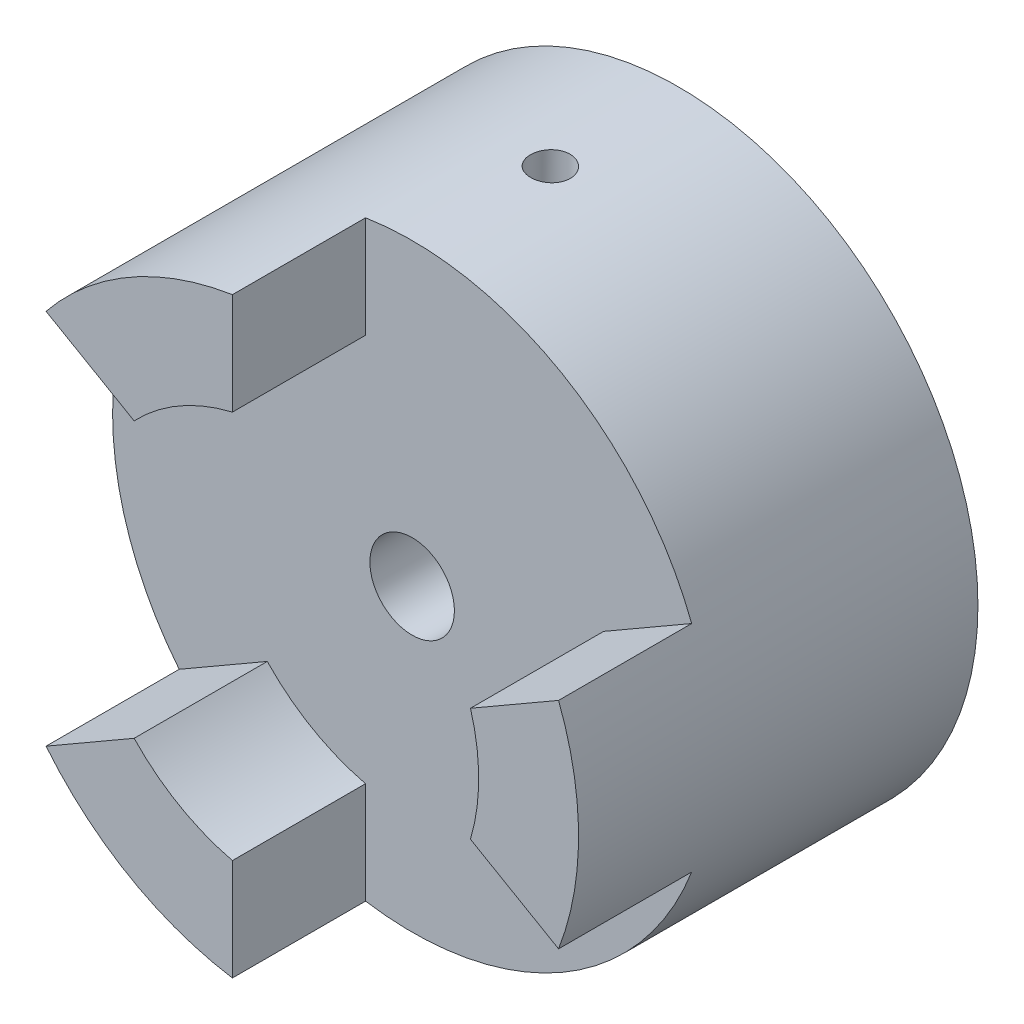
ISO-10303-21;
HEADER;
FILE_DESCRIPTION(('STEP AP214'),'2;1');
FILE_NAME('part.step','',(''),(''),'','','');
FILE_SCHEMA(('AUTOMOTIVE_DESIGN { 1 0 10303 214 1 1 1 1 }'));
ENDSEC;
DATA;
#1=APPLICATION_CONTEXT('core data for automotive mechanical design processes');
#2=APPLICATION_PROTOCOL_DEFINITION('international standard','automotive_design',2000,#1);
#3=PRODUCT_CONTEXT('',#1,'mechanical');
#4=PRODUCT('Part','Part','',(#3));
#5=PRODUCT_RELATED_PRODUCT_CATEGORY('part','',(#4));
#6=PRODUCT_DEFINITION_FORMATION('','',#4);
#7=PRODUCT_DEFINITION_CONTEXT('part definition',#1,'design');
#8=PRODUCT_DEFINITION('design','',#6,#7);
#9=PRODUCT_DEFINITION_SHAPE('','',#8);
#10=(LENGTH_UNIT() NAMED_UNIT(*) SI_UNIT(.MILLI.,.METRE.));
#11=(NAMED_UNIT(*) PLANE_ANGLE_UNIT() SI_UNIT($,.RADIAN.));
#12=(NAMED_UNIT(*) SI_UNIT($,.STERADIAN.) SOLID_ANGLE_UNIT());
#13=UNCERTAINTY_MEASURE_WITH_UNIT(LENGTH_MEASURE(1.E-05),#10,'distance_accuracy_value','');
#14=(GEOMETRIC_REPRESENTATION_CONTEXT(3) GLOBAL_UNCERTAINTY_ASSIGNED_CONTEXT((#13)) GLOBAL_UNIT_ASSIGNED_CONTEXT((#10,
#11,#12)) REPRESENTATION_CONTEXT('',''));
#15=CARTESIAN_POINT('',(0.,0.,0.));
#16=DIRECTION('',(0.,0.,1.));
#17=DIRECTION('',(1.,0.,0.));
#18=AXIS2_PLACEMENT_3D('',#15,#16,#17);
#19=CARTESIAN_POINT('',(0.,0.,20.));
#20=DIRECTION('',(0.,0.,1.));
#21=DIRECTION('',(1.,0.,0.));
#22=AXIS2_PLACEMENT_3D('',#19,#20,#21);
#23=PLANE('',#22);
#24=CARTESIAN_POINT('',(0.,0.,20.));
#25=DIRECTION('',(0.,0.,1.));
#26=DIRECTION('',(1.,0.,0.));
#27=AXIS2_PLACEMENT_3D('',#24,#25,#26);
#28=CIRCLE('',#27,3.175);
#29=CARTESIAN_POINT('',(3.175,0.,20.));
#30=VERTEX_POINT('',#29);
#31=EDGE_CURVE('E245',#30,#30,#28,.T.);
#32=ORIENTED_EDGE('',*,*,#31,.F.);
#33=EDGE_LOOP('',(#32));
#34=FACE_BOUND('',#33,.T.);
#35=CARTESIAN_POINT('',(0.,0.,20.));
#36=DIRECTION('',(0.,0.,-1.));
#37=DIRECTION('',(1.,0.,0.));
#38=AXIS2_PLACEMENT_3D('',#35,#36,#37);
#39=CIRCLE('',#38,15.);
#40=CARTESIAN_POINT('',(-3.5,-14.5859521458148,20.));
#41=VERTEX_POINT('',#40);
#42=CARTESIAN_POINT('',(-10.8818050966599,-10.3240649861528,20.));
#43=VERTEX_POINT('',#42);
#44=EDGE_CURVE('E54',#41,#43,#39,.T.);
#45=ORIENTED_EDGE('',*,*,#44,.F.);
#46=DIRECTION('',(0.,1.,0.));
#47=VECTOR('',#46,1.);
#48=CARTESIAN_POINT('',(-3.5,-14.5859521458148,20.));
#49=LINE('',#48,#47);
#50=CARTESIAN_POINT('',(-3.5,-22.2261107708929,20.));
#51=VERTEX_POINT('',#50);
#52=EDGE_CURVE('E403',#51,#41,#49,.T.);
#53=ORIENTED_EDGE('',*,*,#52,.F.);
#54=CARTESIAN_POINT('',(0.,0.,20.));
#55=DIRECTION('',(0.,0.,1.));
#56=DIRECTION('',(1.,0.,0.));
#57=AXIS2_PLACEMENT_3D('',#54,#55,#56);
#58=CIRCLE('',#57,22.5);
#59=CARTESIAN_POINT('',(20.9983765549201,-8.081966472201,20.));
#60=VERTEX_POINT('',#59);
#61=EDGE_CURVE('E40',#51,#60,#58,.T.);
#62=ORIENTED_EDGE('',*,*,#61,.T.);
#63=DIRECTION('',(0.866025403784436,-0.500000000000004,0.));
#64=VECTOR('',#63,1.);
#65=CARTESIAN_POINT('',(20.9983765549201,-8.081966472201,20.));
#66=LINE('',#65,#64);
#67=CARTESIAN_POINT('',(14.3818050966598,-4.26188715966194,20.));
#68=VERTEX_POINT('',#67);
#69=EDGE_CURVE('E162',#68,#60,#66,.T.);
#70=ORIENTED_EDGE('',*,*,#69,.F.);
#71=CARTESIAN_POINT('',(0.,0.,20.));
#72=DIRECTION('',(0.,0.,-1.));
#73=DIRECTION('',(1.,0.,0.));
#74=AXIS2_PLACEMENT_3D('',#71,#72,#73);
#75=CIRCLE('',#74,15.);
#76=CARTESIAN_POINT('',(14.3818050966598,4.26188715966176,20.));
#77=VERTEX_POINT('',#76);
#78=EDGE_CURVE('E152',#77,#68,#75,.T.);
#79=ORIENTED_EDGE('',*,*,#78,.F.);
#80=DIRECTION('',(-0.866025403784443,-0.499999999999992,0.));
#81=VECTOR('',#80,1.);
#82=CARTESIAN_POINT('',(14.3818050966598,4.26188715966176,20.));
#83=LINE('',#82,#81);
#84=CARTESIAN_POINT('',(20.9983765549202,8.08196647220072,20.));
#85=VERTEX_POINT('',#84);
#86=EDGE_CURVE('E150',#85,#77,#83,.T.);
#87=ORIENTED_EDGE('',*,*,#86,.F.);
#88=CARTESIAN_POINT('',(-3.50000000000001,22.2261107708929,20.));
#89=VERTEX_POINT('',#88);
#90=EDGE_CURVE('E217',#85,#89,#58,.T.);
#91=ORIENTED_EDGE('',*,*,#90,.T.);
#92=DIRECTION('',(0.,1.,0.));
#93=VECTOR('',#92,1.);
#94=CARTESIAN_POINT('',(-3.5,22.2261107708929,20.));
#95=LINE('',#94,#93);
#96=CARTESIAN_POINT('',(-3.5,14.5859521458148,20.));
#97=VERTEX_POINT('',#96);
#98=EDGE_CURVE('E195',#97,#89,#95,.T.);
#99=ORIENTED_EDGE('',*,*,#98,.F.);
#100=CARTESIAN_POINT('',(0.,0.,20.));
#101=DIRECTION('',(0.,0.,-1.));
#102=DIRECTION('',(1.,0.,0.));
#103=AXIS2_PLACEMENT_3D('',#100,#101,#102);
#104=CIRCLE('',#103,15.);
#105=CARTESIAN_POINT('',(-10.8818050966597,10.324064986153,20.));
#106=VERTEX_POINT('',#105);
#107=EDGE_CURVE('E181',#106,#97,#104,.T.);
#108=ORIENTED_EDGE('',*,*,#107,.F.);
#109=DIRECTION('',(0.866025403784436,-0.500000000000004,0.));
#110=VECTOR('',#109,1.);
#111=CARTESIAN_POINT('',(-17.4983765549201,14.1441442986921,20.));
#112=LINE('',#111,#110);
#113=CARTESIAN_POINT('',(-17.4983765549201,14.144144298692,20.));
#114=VERTEX_POINT('',#113);
#115=EDGE_CURVE('E186',#114,#106,#112,.T.);
#116=ORIENTED_EDGE('',*,*,#115,.F.);
#117=CARTESIAN_POINT('',(-17.4983765549203,-14.1441442986918,20.));
#118=VERTEX_POINT('',#117);
#119=EDGE_CURVE('E46',#114,#118,#58,.T.);
#120=ORIENTED_EDGE('',*,*,#119,.T.);
#121=DIRECTION('',(-0.866025403784443,-0.499999999999992,0.));
#122=VECTOR('',#121,1.);
#123=CARTESIAN_POINT('',(-17.4983765549203,-14.1441442986918,20.));
#124=LINE('',#123,#122);
#125=EDGE_CURVE('E59',#43,#118,#124,.T.);
#126=ORIENTED_EDGE('',*,*,#125,.F.);
#127=EDGE_LOOP('',(#45,#53,#62,#70,#79,#87,#91,#99,#108,#116,#120,#126));
#128=FACE_BOUND('',#127,.T.);
#129=ADVANCED_FACE('F35',(#34,#128),#23,.T.);
#130=CARTESIAN_POINT('',(0.,0.,20.));
#131=DIRECTION('',(0.,0.,-1.));
#132=DIRECTION('',(-1.,0.,0.));
#133=AXIS2_PLACEMENT_3D('',#130,#131,#132);
#134=CYLINDRICAL_SURFACE('',#133,22.5);
#135=CARTESIAN_POINT('',(-1.16795072214175,22.4696660213419,9.9509839765561));
#136=CARTESIAN_POINT('',(-1.16794701412822,22.4696666351266,9.86682882468708));
#137=CARTESIAN_POINT('',(-1.16083853462614,22.4700392018296,9.78261503637612));
#138=CARTESIAN_POINT('',(-1.13258449434566,22.471480697484,9.61651364954389));
#139=CARTESIAN_POINT('',(-1.11142267175415,22.4725504331371,9.5346288606282));
#140=CARTESIAN_POINT('',(-1.05567496758904,22.4752380311045,9.37561546316127));
#141=CARTESIAN_POINT('',(-1.02109626483874,22.4768556002368,9.29848433665232));
#142=CARTESIAN_POINT('',(-0.939510841472762,22.4804132200468,9.15113626091315));
#143=CARTESIAN_POINT('',(-0.892506933100566,22.4823531977157,9.08091775205354));
#144=CARTESIAN_POINT('',(-0.787321799091392,22.4862822653723,8.9492495333017));
#145=CARTESIAN_POINT('',(-0.729123980123893,22.488271424401,8.88781308018272));
#146=CARTESIAN_POINT('',(-0.603241089186681,22.4919998434333,8.77556647860183));
#147=CARTESIAN_POINT('',(-0.535555618423458,22.4937390929262,8.72475677703693));
#148=CARTESIAN_POINT('',(-0.392546510837813,22.4966890716028,8.63516458913433));
#149=CARTESIAN_POINT('',(-0.317215933429358,22.4978993151447,8.59639316367709));
#150=CARTESIAN_POINT('',(-0.161106583630494,22.4995584749486,8.53204891038463));
#151=CARTESIAN_POINT('',(-0.0803278761180135,22.500007400275,8.50647592540988));
#152=CARTESIAN_POINT('',(0.0842541461032171,22.4999924287302,8.46929151286395));
#153=CARTESIAN_POINT('',(0.168052740501643,22.499529900542,8.4576591934942));
#154=CARTESIAN_POINT('',(0.336402293717323,22.4976425119387,8.44862178180597));
#155=CARTESIAN_POINT('',(0.420953243062837,22.4962176636219,8.45121651062898));
#156=CARTESIAN_POINT('',(0.588266129708601,22.4924639826339,8.47054233443924));
#157=CARTESIAN_POINT('',(0.67103069653389,22.4901365901524,8.48725095768299));
#158=CARTESIAN_POINT('',(0.832565993292586,22.4847363612551,8.53429538928928));
#159=CARTESIAN_POINT('',(0.911336697020258,22.4816635199487,8.56463128705432));
#160=CARTESIAN_POINT('',(1.06272261164742,22.4750166272793,8.63809451797387));
#161=CARTESIAN_POINT('',(1.13533287297505,22.4714421789089,8.6812320136648));
#162=CARTESIAN_POINT('',(1.2722859030292,22.4641046836031,8.77906653524814));
#163=CARTESIAN_POINT('',(1.33662856545644,22.4603416342438,8.83376370974329));
#164=CARTESIAN_POINT('',(1.45535453244866,22.4529618562286,8.95329180612418));
#165=CARTESIAN_POINT('',(1.50971821721403,22.449345426488,9.01814223651269));
#166=CARTESIAN_POINT('',(1.60679530484671,22.4426064521477,9.15606769541081));
#167=CARTESIAN_POINT('',(1.64950870236193,22.439483907775,9.22914272769877));
#168=CARTESIAN_POINT('',(1.7220745704774,22.4340319588832,9.38145576222379));
#169=CARTESIAN_POINT('',(1.75192618133141,22.4317026073872,9.46069417603434));
#170=CARTESIAN_POINT('',(1.79790975507206,22.4280640531212,9.62307881670943));
#171=CARTESIAN_POINT('',(1.81404190173043,22.4267548366865,9.7062249912139));
#172=CARTESIAN_POINT('',(1.83210546711131,22.4252864697945,9.87389368251136));
#173=CARTESIAN_POINT('',(1.83406414738777,22.4251251115319,9.95841324354472));
#174=CARTESIAN_POINT('',(1.82379660597111,22.4259624418472,10.1265800340995));
#175=CARTESIAN_POINT('',(1.81157046841159,22.4269611235448,10.2102272687919));
#176=CARTESIAN_POINT('',(1.77330198524295,22.430019264112,10.3741975858724));
#177=CARTESIAN_POINT('',(1.74727222536644,22.432077756628,10.4545236246261));
#178=CARTESIAN_POINT('',(1.68214605935868,22.4370551772429,10.60966269689));
#179=CARTESIAN_POINT('',(1.64304951843054,22.4399741142182,10.6844756735177));
#180=CARTESIAN_POINT('',(1.5528271333128,22.4463976750895,10.8265902326363));
#181=CARTESIAN_POINT('',(1.50168303140065,22.4499031855614,10.8938801836915));
#182=CARTESIAN_POINT('',(1.38884040962061,22.4571661269891,11.0189213375547));
#183=CARTESIAN_POINT('',(1.3271417726129,22.4609235607405,11.0766724344814));
#184=CARTESIAN_POINT('',(1.19482048170147,22.4683509312009,11.1810888947149));
#185=CARTESIAN_POINT('',(1.1241838714648,22.4720207201659,11.2277365849532));
#186=CARTESIAN_POINT('',(0.976058442943612,22.4789412520019,11.3085010832813));
#187=CARTESIAN_POINT('',(0.89856967163721,22.4821919977453,11.3426179772733));
#188=CARTESIAN_POINT('',(0.739001568444851,22.4880021362221,11.3973217571046));
#189=CARTESIAN_POINT('',(0.656926076696509,22.4905620971359,11.4179197825061));
#190=CARTESIAN_POINT('',(0.49045958171309,22.4948078152173,11.445037570028));
#191=CARTESIAN_POINT('',(0.40606860499338,22.4964935823911,11.4515574932931));
#192=CARTESIAN_POINT('',(0.237540917170963,22.4989035911875,11.4503323899263));
#193=CARTESIAN_POINT('',(0.153404030342545,22.4996296909851,11.4426150002337));
#194=CARTESIAN_POINT('',(-0.0123898446146695,22.5001493640251,11.4131917004924));
#195=CARTESIAN_POINT('',(-0.094046828527573,22.4999429356823,11.3914857666642));
#196=CARTESIAN_POINT('',(-0.252564896325961,22.4987221590962,11.3347079254833));
#197=CARTESIAN_POINT('',(-0.329426048193699,22.4977078223081,11.2996362076445));
#198=CARTESIAN_POINT('',(-0.476181328642586,22.4950804526772,11.2171260186757));
#199=CARTESIAN_POINT('',(-0.546075625279928,22.4934674342804,11.1696878459523));
#200=CARTESIAN_POINT('',(-0.677050473510534,22.4899068565662,11.0636887007921));
#201=CARTESIAN_POINT('',(-0.738114734161111,22.4879586930601,11.0051076197651));
#202=CARTESIAN_POINT('',(-0.849564286877072,22.4840245335145,10.8785150339242));
#203=CARTESIAN_POINT('',(-0.899946966889859,22.4820385283505,10.8105012291612));
#204=CARTESIAN_POINT('',(-0.9886424430826,22.47831322808,10.666886676364));
#205=CARTESIAN_POINT('',(-1.02693884290122,22.4765742698621,10.5912758037275));
#206=CARTESIAN_POINT('',(-1.09023738754139,22.47359330319,10.4347413302532));
#207=CARTESIAN_POINT('',(-1.11525505244659,22.4723507150045,10.3538240563899));
#208=CARTESIAN_POINT('',(-1.14480459317688,22.4708599339827,10.2188429666264));
#209=CARTESIAN_POINT('',(-1.15347308513632,22.4704146367155,10.165650945378));
#210=CARTESIAN_POINT('',(-1.16504733114898,22.4698174842866,10.0586419413207));
#211=CARTESIAN_POINT('',(-1.16795309446345,22.4696656286533,10.0048249595162));
#212=CARTESIAN_POINT('',(-1.16795072214175,22.4696660213419,9.9509839765561));
#213=B_SPLINE_CURVE_WITH_KNOTS('',3,(#135,#136,#137,#138,#139,#140,#141,#142,#143,#144,#145,
#146,#147,#148,#149,#150,#151,#152,#153,#154,#155,#156,#157,#158,#159,#160,#161,#162,#163,#164,
#165,#166,#167,#168,#169,#170,#171,#172,#173,#174,#175,#176,#177,#178,#179,#180,#181,#182,#183,
#184,#185,#186,#187,#188,#189,#190,#191,#192,#193,#194,#195,#196,#197,#198,#199,#200,#201,#202,
#203,#204,#205,#206,#207,#208,#209,#210,#211,#212),.UNSPECIFIED.,.T.,.F.,(4,2,2,2,2,2,2,2,2,2,2,
2,2,2,2,2,2,2,2,2,2,2,2,2,2,2,2,2,2,2,2,2,2,2,2,2,2,2,4),(0.,0.252268897261408,
0.504830217080159,0.757256587612157,1.0096258743797,1.26237218560875,1.51512912368541,
1.76811761462682,2.02110309343897,2.27370896646024,2.52631166379775,2.7785129306925,
3.03071585219184,3.28311952276676,3.53552643825509,3.78842441965064,4.04132251722657,
4.2942375171565,4.54714912924566,4.7995741560111,5.05199768558994,5.30419145760964,
5.55638783133998,5.80896888837173,6.06155274886383,6.31453599310349,6.567517503036,
6.82029029333925,7.07306019026671,7.32533993592649,7.57762011044376,7.82989670800653,
8.0821672186178,8.33489737367269,8.58768925975639,8.84082262604519,9.09365947683888,
9.25505693053532,9.41645412485044),.UNSPECIFIED.);
#214=CARTESIAN_POINT('',(-1.16795072214175,22.4696660213419,9.9509839765561));
#215=VERTEX_POINT('',#214);
#216=EDGE_CURVE('E11',#215,#215,#213,.T.);
#217=ORIENTED_EDGE('',*,*,#216,.T.);
#218=EDGE_LOOP('',(#217));
#219=FACE_BOUND('',#218,.T.);
#220=ORIENTED_EDGE('',*,*,#119,.F.);
#221=DIRECTION('',(0.,0.,-1.));
#222=VECTOR('',#221,1.);
#223=CARTESIAN_POINT('',(-17.4983765549201,14.1441442986921,30.));
#224=LINE('',#223,#222);
#225=CARTESIAN_POINT('',(-17.4983765549201,14.1441442986921,30.));
#226=VERTEX_POINT('',#225);
#227=EDGE_CURVE('E207',#226,#114,#224,.T.);
#228=ORIENTED_EDGE('',*,*,#227,.F.);
#229=CARTESIAN_POINT('',(0.,0.,30.));
#230=DIRECTION('',(0.,0.,1.));
#231=DIRECTION('',(1.,0.,0.));
#232=AXIS2_PLACEMENT_3D('',#229,#230,#231);
#233=CIRCLE('',#232,22.5);
#234=CARTESIAN_POINT('',(-3.50000000000001,22.2261107708929,30.));
#235=VERTEX_POINT('',#234);
#236=EDGE_CURVE('E188',#235,#226,#233,.T.);
#237=ORIENTED_EDGE('',*,*,#236,.F.);
#238=DIRECTION('',(0.,0.,-1.));
#239=VECTOR('',#238,1.);
#240=CARTESIAN_POINT('',(-3.50000000000001,22.2261107708929,30.));
#241=LINE('',#240,#239);
#242=EDGE_CURVE('E203',#235,#89,#241,.T.);
#243=ORIENTED_EDGE('',*,*,#242,.T.);
#244=ORIENTED_EDGE('',*,*,#90,.F.);
#245=DIRECTION('',(0.,0.,-1.));
#246=VECTOR('',#245,1.);
#247=CARTESIAN_POINT('',(20.9983765549202,8.08196647220072,30.));
#248=LINE('',#247,#246);
#249=CARTESIAN_POINT('',(20.9983765549202,8.08196647220072,30.));
#250=VERTEX_POINT('',#249);
#251=EDGE_CURVE('E179',#250,#85,#248,.T.);
#252=ORIENTED_EDGE('',*,*,#251,.F.);
#253=CARTESIAN_POINT('',(0.,0.,30.));
#254=DIRECTION('',(0.,0.,1.));
#255=DIRECTION('',(1.,0.,0.));
#256=AXIS2_PLACEMENT_3D('',#253,#254,#255);
#257=CIRCLE('',#256,22.5);
#258=CARTESIAN_POINT('',(20.9983765549201,-8.081966472201,30.));
#259=VERTEX_POINT('',#258);
#260=EDGE_CURVE('E158',#259,#250,#257,.T.);
#261=ORIENTED_EDGE('',*,*,#260,.F.);
#262=DIRECTION('',(0.,0.,-1.));
#263=VECTOR('',#262,1.);
#264=CARTESIAN_POINT('',(20.9983765549201,-8.081966472201,30.));
#265=LINE('',#264,#263);
#266=EDGE_CURVE('E167',#259,#60,#265,.T.);
#267=ORIENTED_EDGE('',*,*,#266,.T.);
#268=ORIENTED_EDGE('',*,*,#61,.F.);
#269=DIRECTION('',(0.,0.,-1.));
#270=VECTOR('',#269,1.);
#271=CARTESIAN_POINT('',(-3.5,-22.2261107708929,30.));
#272=LINE('',#271,#270);
#273=CARTESIAN_POINT('',(-3.5,-22.2261107708929,30.));
#274=VERTEX_POINT('',#273);
#275=EDGE_CURVE('E131',#274,#51,#272,.T.);
#276=ORIENTED_EDGE('',*,*,#275,.F.);
#277=CARTESIAN_POINT('',(0.,0.,30.));
#278=DIRECTION('',(0.,0.,1.));
#279=DIRECTION('',(1.,0.,0.));
#280=AXIS2_PLACEMENT_3D('',#277,#278,#279);
#281=CIRCLE('',#280,22.5);
#282=CARTESIAN_POINT('',(-17.4983765549203,-14.1441442986918,30.));
#283=VERTEX_POINT('',#282);
#284=EDGE_CURVE('E137',#283,#274,#281,.T.);
#285=ORIENTED_EDGE('',*,*,#284,.F.);
#286=DIRECTION('',(0.,0.,-1.));
#287=VECTOR('',#286,1.);
#288=CARTESIAN_POINT('',(-17.4983765549203,-14.1441442986918,30.));
#289=LINE('',#288,#287);
#290=EDGE_CURVE('E395',#283,#118,#289,.T.);
#291=ORIENTED_EDGE('',*,*,#290,.T.);
#292=EDGE_LOOP('',(#220,#228,#237,#243,#244,#252,#261,#267,#268,#276,#285,#291));
#293=FACE_BOUND('',#292,.T.);
#294=CARTESIAN_POINT('',(0.,0.,0.));
#295=DIRECTION('',(0.,0.,1.));
#296=DIRECTION('',(1.,0.,0.));
#297=AXIS2_PLACEMENT_3D('',#294,#295,#296);
#298=CIRCLE('',#297,22.5);
#299=CARTESIAN_POINT('',(22.5,0.,0.));
#300=VERTEX_POINT('',#299);
#301=EDGE_CURVE('E218',#300,#300,#298,.T.);
#302=ORIENTED_EDGE('',*,*,#301,.T.);
#303=EDGE_LOOP('',(#302));
#304=FACE_BOUND('',#303,.T.);
#305=ADVANCED_FACE('F37',(#219,#293,#304),#134,.T.);
#306=CARTESIAN_POINT('',(0.,0.,0.));
#307=DIRECTION('',(0.,0.,1.));
#308=DIRECTION('',(1.,0.,0.));
#309=AXIS2_PLACEMENT_3D('',#306,#307,#308);
#310=PLANE('',#309);
#311=CARTESIAN_POINT('',(0.,0.,0.));
#312=DIRECTION('',(0.,0.,1.));
#313=DIRECTION('',(1.,0.,0.));
#314=AXIS2_PLACEMENT_3D('',#311,#312,#313);
#315=CIRCLE('',#314,3.175);
#316=CARTESIAN_POINT('',(3.175,0.,0.));
#317=VERTEX_POINT('',#316);
#318=EDGE_CURVE('E247',#317,#317,#315,.F.);
#319=ORIENTED_EDGE('',*,*,#318,.F.);
#320=EDGE_LOOP('',(#319));
#321=FACE_BOUND('',#320,.T.);
#322=ORIENTED_EDGE('',*,*,#301,.F.);
#323=EDGE_LOOP('',(#322));
#324=FACE_BOUND('',#323,.T.);
#325=ADVANCED_FACE('F254',(#321,#324),#310,.F.);
#326=CARTESIAN_POINT('',(0.,0.,-0.001000000000001));
#327=DIRECTION('',(0.,0.,1.));
#328=DIRECTION('',(1.,0.,0.));
#329=AXIS2_PLACEMENT_3D('',#326,#327,#328);
#330=CYLINDRICAL_SURFACE('',#329,3.175);
#331=CARTESIAN_POINT('',(-1.45846746004984,2.82019461526607,9.9509839765561));
#332=CARTESIAN_POINT('',(-1.45846261348466,2.82020012863268,10.0297947241571));
#333=CARTESIAN_POINT('',(-1.45216651656975,2.8234807048294,10.1087195887618));
#334=CARTESIAN_POINT('',(-1.42728378530454,2.83613641176793,10.2641986440708));
#335=CARTESIAN_POINT('',(-1.40866855306037,2.84552572259358,10.340746883719));
#336=CARTESIAN_POINT('',(-1.36010699034758,2.86905055896896,10.4889366503128));
#337=CARTESIAN_POINT('',(-1.33021588438959,2.88316291561289,10.5606001129879));
#338=CARTESIAN_POINT('',(-1.26013603354991,2.91447254694655,10.6979133694037));
#339=CARTESIAN_POINT('',(-1.21994772678186,2.93166969037892,10.763563418835));
#340=CARTESIAN_POINT('',(-1.1269788086257,2.96870721744521,10.8923072218145));
#341=CARTESIAN_POINT('',(-1.07349165745065,2.98864894211236,10.9548618650468));
#342=CARTESIAN_POINT('',(-0.956953526331019,3.02797738462901,11.0705754134055));
#343=CARTESIAN_POINT('',(-0.893898214610589,3.04736384634557,11.1237300391565));
#344=CARTESIAN_POINT('',(-0.75551557703366,3.08467903021385,11.2221733561039));
#345=CARTESIAN_POINT('',(-0.679685607713575,3.10245573138965,11.2668184778078));
#346=CARTESIAN_POINT('',(-0.520601275119072,3.13307242733605,11.3425214986179));
#347=CARTESIAN_POINT('',(-0.437351138628172,3.1459152107735,11.3735870743014));
#348=CARTESIAN_POINT('',(-0.271513116606294,3.16439718286724,11.4191782964123));
#349=CARTESIAN_POINT('',(-0.189230669472668,3.17044856982979,11.4346437771565));
#350=CARTESIAN_POINT('',(-0.0230360499826976,3.17600263175812,11.451670675019));
#351=CARTESIAN_POINT('',(0.0608752309646392,3.17550879314425,11.4532394936764));
#352=CARTESIAN_POINT('',(0.220965341081471,3.16823661605366,11.4428370839366));
#353=CARTESIAN_POINT('',(0.297237625202313,3.16195047331181,11.4319103449842));
#354=CARTESIAN_POINT('',(0.446639262698876,3.14432792019328,11.3986684885509));
#355=CARTESIAN_POINT('',(0.51976838201806,3.13299113443116,11.3763525245561));
#356=CARTESIAN_POINT('',(0.662152258237365,3.10604443941147,11.3207657846758));
#357=CARTESIAN_POINT('',(0.731333780067877,3.09037385181341,11.287337976582));
#358=CARTESIAN_POINT('',(0.86323679139233,3.05615725914194,11.2106649400781));
#359=CARTESIAN_POINT('',(0.925955902904342,3.03761020185458,11.1674161164378));
#360=CARTESIAN_POINT('',(1.04896397745752,2.9974722618093,11.0680017422262));
#361=CARTESIAN_POINT('',(1.10857063799743,2.97575689759388,11.0110413445876));
#362=CARTESIAN_POINT('',(1.21773064995103,2.93278118999334,10.8879810362005));
#363=CARTESIAN_POINT('',(1.26727769141293,2.91152113963828,10.8218754325072));
#364=CARTESIAN_POINT('',(1.35742780560897,2.87064348486769,10.6781561147072));
#365=CARTESIAN_POINT('',(1.39743239487526,2.85116861680018,10.6001229185524));
#366=CARTESIAN_POINT('',(1.46352238627895,2.81782050992976,10.4372677200871));
#367=CARTESIAN_POINT('',(1.48962089344523,2.80394200015535,10.3524521964317));
#368=CARTESIAN_POINT('',(1.52520500303223,2.78473642361054,10.1852376812937));
#369=CARTESIAN_POINT('',(1.53579833140831,2.77884170307558,10.1031415346259));
#370=CARTESIAN_POINT('',(1.54340024993269,2.77462893156984,9.93814752209321));
#371=CARTESIAN_POINT('',(1.54041632858535,2.7763067040019,9.85525012332922));
#372=CARTESIAN_POINT('',(1.52196122984646,2.7864576632002,9.69914287537538));
#373=CARTESIAN_POINT('',(1.5076697866876,2.79428839178957,9.62574584301641));
#374=CARTESIAN_POINT('',(1.46868087713427,2.8149750829335,9.4825203435047));
#375=CARTESIAN_POINT('',(1.44398044197107,2.82783247907799,9.41269290081758));
#376=CARTESIAN_POINT('',(1.38363241448761,2.85786073358363,9.27494816903112));
#377=CARTESIAN_POINT('',(1.34753198109492,2.87520335986173,9.20726798241603));
#378=CARTESIAN_POINT('',(1.2657987466394,2.9121105685596,9.07859414795535));
#379=CARTESIAN_POINT('',(1.22016119059583,2.93167625711614,9.01760385875011));
#380=CARTESIAN_POINT('',(1.11474217477792,2.97347065182044,8.89703275226325));
#381=CARTESIAN_POINT('',(1.05395709781477,2.99575554418908,8.83834496736544));
#382=CARTESIAN_POINT('',(0.922975351297082,3.03866556244363,8.7318177634342));
#383=CARTESIAN_POINT('',(0.85277652453668,3.05929030615984,8.68398083770981));
#384=CARTESIAN_POINT('',(0.703236627902298,3.0971148442252,8.59992057222914));
#385=CARTESIAN_POINT('',(0.623764001458209,3.1142526193327,8.56390153477736));
#386=CARTESIAN_POINT('',(0.458838265981418,3.14278121193045,8.50611804153255));
#387=CARTESIAN_POINT('',(0.373389893653803,3.15417652371314,8.48434243424401));
#388=CARTESIAN_POINT('',(0.206771342030913,3.16926927427465,8.45734508220151));
#389=CARTESIAN_POINT('',(0.125854679648905,3.17353858802618,8.45087384022968));
#390=CARTESIAN_POINT('',(-0.0360379381036619,3.1758261799541,8.45109685689927));
#391=CARTESIAN_POINT('',(-0.117013870621537,3.1738462025134,8.45778744144517));
#392=CARTESIAN_POINT('',(-0.272093774401034,3.16422234614703,8.48327549632523));
#393=CARTESIAN_POINT('',(-0.346331555091031,3.15689361124839,8.50139200163617));
#394=CARTESIAN_POINT('',(-0.490694368091594,3.13769832195252,8.54836289108132));
#395=CARTESIAN_POINT('',(-0.560818743801695,3.12583104535372,8.57721898414728));
#396=CARTESIAN_POINT('',(-0.698475226872397,3.09804945977873,8.64624907466325));
#397=CARTESIAN_POINT('',(-0.765748027968675,3.08197684751009,8.68687458264789));
#398=CARTESIAN_POINT('',(-0.892849439664938,3.04758712129625,8.77769965563638));
#399=CARTESIAN_POINT('',(-0.952674649565073,3.02926898952946,8.82790356800129));
#400=CARTESIAN_POINT('',(-1.06878503324807,2.9903845040439,8.94169950877528));
#401=CARTESIAN_POINT('',(-1.12427423756322,2.9697636615863,9.0060876033825));
#402=CARTESIAN_POINT('',(-1.22387317630641,2.93012648437165,9.14367183080762));
#403=CARTESIAN_POINT('',(-1.26797454964807,2.91111133538902,9.21687437781159));
#404=CARTESIAN_POINT('',(-1.34399165589068,2.87681862469662,9.37175155434531));
#405=CARTESIAN_POINT('',(-1.37569750558593,2.86160689065835,9.45354462403088));
#406=CARTESIAN_POINT('',(-1.42432781720315,2.83772272253655,9.62217197822689));
#407=CARTESIAN_POINT('',(-1.44130190171828,2.82902834892217,9.70898827988403));
#408=CARTESIAN_POINT('',(-1.45311875824246,2.82295474980443,9.82228934330811));
#409=CARTESIAN_POINT('',(-1.45512203911011,2.82192255652229,9.84797216880852));
#410=CARTESIAN_POINT('',(-1.45779721668426,2.8205415699771,9.89942724704792));
#411=CARTESIAN_POINT('',(-1.45846904569811,2.82019281146072,9.925199504267));
#412=CARTESIAN_POINT('',(-1.45846746004984,2.82019461526607,9.9509839765561));
#413=B_SPLINE_CURVE_WITH_KNOTS('',3,(#331,#332,#333,#334,#335,#336,#337,#338,#339,#340,#341,
#342,#343,#344,#345,#346,#347,#348,#349,#350,#351,#352,#353,#354,#355,#356,#357,#358,#359,#360,
#361,#362,#363,#364,#365,#366,#367,#368,#369,#370,#371,#372,#373,#374,#375,#376,#377,#378,#379,
#380,#381,#382,#383,#384,#385,#386,#387,#388,#389,#390,#391,#392,#393,#394,#395,#396,#397,#398,
#399,#400,#401,#402,#403,#404,#405,#406,#407,#408,#409,#410,#411,#412),.UNSPECIFIED.,.T.,.F.,(4,
2,2,2,2,2,2,2,2,2,2,2,2,2,2,2,2,2,2,2,2,2,2,2,2,2,2,2,2,2,2,2,2,2,2,2,2,2,2,2,4),(0.,
0.236323871838545,0.473198284289301,0.708927337380697,0.944646362603913,1.19762429635865,
1.45071710395354,1.71864285343498,1.98641694681215,2.23687152724756,2.48719270436036,
2.7180281701866,2.94888079555673,3.18314531005559,3.41749572162705,3.67216706074963,
3.92699765369086,4.19506898546714,4.46288723920478,4.71043828617546,4.95785281342713,
5.18239796950744,5.40700721193727,5.64198832122137,5.8770868671668,6.13804637958082,
6.39906579463171,6.6643851940119,6.92949661955735,7.17207877892641,7.41459323161725,
7.64386670961208,7.87317668624819,8.11282240294704,8.35257714778316,8.61378861881712,
8.87519133270401,9.14084608292563,9.40560248746473,9.48291651801965,9.56023447921346),.UNSPECIFIED.);
#414=CARTESIAN_POINT('',(-1.45846746004984,2.82019461526607,9.9509839765561));
#415=VERTEX_POINT('',#414);
#416=EDGE_CURVE('E240',#415,#415,#413,.T.);
#417=ORIENTED_EDGE('',*,*,#416,.T.);
#418=EDGE_LOOP('',(#417));
#419=FACE_BOUND('',#418,.T.);
#420=ORIENTED_EDGE('',*,*,#31,.T.);
#421=EDGE_LOOP('',(#420));
#422=FACE_BOUND('',#421,.T.);
#423=ORIENTED_EDGE('',*,*,#318,.T.);
#424=EDGE_LOOP('',(#423));
#425=FACE_BOUND('',#424,.T.);
#426=ADVANCED_FACE('F233',(#419,#422,#425),#330,.F.);
#427=CARTESIAN_POINT('',(0.332625348918888,22.4975412073688,9.9509839765561));
#428=DIRECTION('',(0.0147833488408394,0.999890720327502,0.));
#429=DIRECTION('',(-0.999890720327502,0.0147833488408394,0.));
#430=AXIS2_PLACEMENT_3D('',#427,#428,#429);
#431=CYLINDRICAL_SURFACE('',#430,1.49999999999999);
#432=ORIENTED_EDGE('',*,*,#216,.F.);
#433=EDGE_LOOP('',(#432));
#434=FACE_BOUND('',#433,.T.);
#435=ORIENTED_EDGE('',*,*,#416,.F.);
#436=EDGE_LOOP('',(#435));
#437=FACE_BOUND('',#436,.T.);
#438=ADVANCED_FACE('F227',(#434,#437),#431,.F.);
#439=CARTESIAN_POINT('',(0.,0.,30.));
#440=DIRECTION('',(0.,0.,-1.));
#441=DIRECTION('',(-1.,0.,0.));
#442=AXIS2_PLACEMENT_3D('',#439,#440,#441);
#443=CYLINDRICAL_SURFACE('',#442,15.);
#444=ORIENTED_EDGE('',*,*,#107,.T.);
#445=DIRECTION('',(0.,0.,-1.));
#446=VECTOR('',#445,1.);
#447=CARTESIAN_POINT('',(-3.5,14.5859521458148,30.));
#448=LINE('',#447,#446);
#449=CARTESIAN_POINT('',(-3.5,14.5859521458148,30.));
#450=VERTEX_POINT('',#449);
#451=EDGE_CURVE('E206',#450,#97,#448,.T.);
#452=ORIENTED_EDGE('',*,*,#451,.F.);
#453=CARTESIAN_POINT('',(0.,0.,30.));
#454=DIRECTION('',(0.,0.,-1.));
#455=DIRECTION('',(1.,0.,0.));
#456=AXIS2_PLACEMENT_3D('',#453,#454,#455);
#457=CIRCLE('',#456,15.);
#458=CARTESIAN_POINT('',(-10.8818050966597,10.324064986153,30.));
#459=VERTEX_POINT('',#458);
#460=EDGE_CURVE('E182',#459,#450,#457,.T.);
#461=ORIENTED_EDGE('',*,*,#460,.F.);
#462=DIRECTION('',(0.,0.,-1.));
#463=VECTOR('',#462,1.);
#464=CARTESIAN_POINT('',(-10.8818050966597,10.324064986153,30.));
#465=LINE('',#464,#463);
#466=EDGE_CURVE('E192',#459,#106,#465,.T.);
#467=ORIENTED_EDGE('',*,*,#466,.T.);
#468=EDGE_LOOP('',(#444,#452,#461,#467));
#469=FACE_BOUND('',#468,.T.);
#470=ADVANCED_FACE('F232',(#469),#443,.F.);
#471=CARTESIAN_POINT('',(-3.5,22.2261107708929,30.));
#472=DIRECTION('',(-1.,0.,0.));
#473=DIRECTION('',(0.,-1.,0.));
#474=AXIS2_PLACEMENT_3D('',#471,#472,#473);
#475=PLANE('',#474);
#476=ORIENTED_EDGE('',*,*,#98,.T.);
#477=ORIENTED_EDGE('',*,*,#242,.F.);
#478=DIRECTION('',(0.,1.,0.));
#479=VECTOR('',#478,1.);
#480=CARTESIAN_POINT('',(-3.5,22.2261107708929,30.));
#481=LINE('',#480,#479);
#482=EDGE_CURVE('E185',#450,#235,#481,.T.);
#483=ORIENTED_EDGE('',*,*,#482,.F.);
#484=ORIENTED_EDGE('',*,*,#451,.T.);
#485=EDGE_LOOP('',(#476,#477,#483,#484));
#486=FACE_BOUND('',#485,.T.);
#487=ADVANCED_FACE('F286',(#486),#475,.F.);
#488=CARTESIAN_POINT('',(-17.4983765549201,14.1441442986921,30.));
#489=DIRECTION('',(0.500000000000004,0.866025403784436,0.));
#490=DIRECTION('',(-0.866025403784436,0.500000000000004,0.));
#491=AXIS2_PLACEMENT_3D('',#488,#489,#490);
#492=PLANE('',#491);
#493=ORIENTED_EDGE('',*,*,#115,.T.);
#494=ORIENTED_EDGE('',*,*,#466,.F.);
#495=DIRECTION('',(0.866025403784436,-0.500000000000004,0.));
#496=VECTOR('',#495,1.);
#497=CARTESIAN_POINT('',(-17.4983765549201,14.1441442986921,30.));
#498=LINE('',#497,#496);
#499=EDGE_CURVE('E190',#226,#459,#498,.T.);
#500=ORIENTED_EDGE('',*,*,#499,.F.);
#501=ORIENTED_EDGE('',*,*,#227,.T.);
#502=EDGE_LOOP('',(#493,#494,#500,#501));
#503=FACE_BOUND('',#502,.T.);
#504=ADVANCED_FACE('F295',(#503),#492,.F.);
#505=CARTESIAN_POINT('',(0.,0.,30.));
#506=DIRECTION('',(0.,0.,1.));
#507=DIRECTION('',(1.,0.,0.));
#508=AXIS2_PLACEMENT_3D('',#505,#506,#507);
#509=PLANE('',#508);
#510=ORIENTED_EDGE('',*,*,#460,.T.);
#511=ORIENTED_EDGE('',*,*,#482,.T.);
#512=ORIENTED_EDGE('',*,*,#236,.T.);
#513=ORIENTED_EDGE('',*,*,#499,.T.);
#514=EDGE_LOOP('',(#510,#511,#512,#513));
#515=FACE_BOUND('',#514,.T.);
#516=ADVANCED_FACE('F304',(#515),#509,.T.);
#517=CARTESIAN_POINT('',(14.3818050966598,4.26188715966176,30.));
#518=DIRECTION('',(0.499999999999992,-0.866025403784443,0.));
#519=DIRECTION('',(0.866025403784443,0.499999999999992,0.));
#520=AXIS2_PLACEMENT_3D('',#517,#518,#519);
#521=PLANE('',#520);
#522=ORIENTED_EDGE('',*,*,#86,.T.);
#523=DIRECTION('',(0.,0.,-1.));
#524=VECTOR('',#523,1.);
#525=CARTESIAN_POINT('',(14.3818050966598,4.26188715966176,30.));
#526=LINE('',#525,#524);
#527=CARTESIAN_POINT('',(14.3818050966598,4.26188715966176,30.));
#528=VERTEX_POINT('',#527);
#529=EDGE_CURVE('E176',#528,#77,#526,.T.);
#530=ORIENTED_EDGE('',*,*,#529,.F.);
#531=DIRECTION('',(-0.866025403784443,-0.499999999999992,0.));
#532=VECTOR('',#531,1.);
#533=CARTESIAN_POINT('',(14.3818050966598,4.26188715966176,30.));
#534=LINE('',#533,#532);
#535=EDGE_CURVE('E161',#250,#528,#534,.T.);
#536=ORIENTED_EDGE('',*,*,#535,.F.);
#537=ORIENTED_EDGE('',*,*,#251,.T.);
#538=EDGE_LOOP('',(#522,#530,#536,#537));
#539=FACE_BOUND('',#538,.T.);
#540=ADVANCED_FACE('F314',(#539),#521,.F.);
#541=CARTESIAN_POINT('',(0.,0.,30.));
#542=DIRECTION('',(0.,0.,-1.));
#543=DIRECTION('',(-1.,0.,0.));
#544=AXIS2_PLACEMENT_3D('',#541,#542,#543);
#545=CYLINDRICAL_SURFACE('',#544,15.);
#546=ORIENTED_EDGE('',*,*,#78,.T.);
#547=DIRECTION('',(0.,0.,-1.));
#548=VECTOR('',#547,1.);
#549=CARTESIAN_POINT('',(14.3818050966598,-4.26188715966194,30.));
#550=LINE('',#549,#548);
#551=CARTESIAN_POINT('',(14.3818050966598,-4.26188715966194,30.));
#552=VERTEX_POINT('',#551);
#553=EDGE_CURVE('E174',#552,#68,#550,.T.);
#554=ORIENTED_EDGE('',*,*,#553,.F.);
#555=CARTESIAN_POINT('',(0.,0.,30.));
#556=DIRECTION('',(0.,0.,-1.));
#557=DIRECTION('',(1.,0.,0.));
#558=AXIS2_PLACEMENT_3D('',#555,#556,#557);
#559=CIRCLE('',#558,15.);
#560=EDGE_CURVE('E164',#528,#552,#559,.T.);
#561=ORIENTED_EDGE('',*,*,#560,.F.);
#562=ORIENTED_EDGE('',*,*,#529,.T.);
#563=EDGE_LOOP('',(#546,#554,#561,#562));
#564=FACE_BOUND('',#563,.T.);
#565=ADVANCED_FACE('F324',(#564),#545,.F.);
#566=CARTESIAN_POINT('',(20.9983765549201,-8.081966472201,30.));
#567=DIRECTION('',(0.500000000000004,0.866025403784436,0.));
#568=DIRECTION('',(-0.866025403784436,0.500000000000004,0.));
#569=AXIS2_PLACEMENT_3D('',#566,#567,#568);
#570=PLANE('',#569);
#571=ORIENTED_EDGE('',*,*,#69,.T.);
#572=ORIENTED_EDGE('',*,*,#266,.F.);
#573=DIRECTION('',(0.866025403784436,-0.500000000000004,0.));
#574=VECTOR('',#573,1.);
#575=CARTESIAN_POINT('',(20.9983765549201,-8.081966472201,30.));
#576=LINE('',#575,#574);
#577=EDGE_CURVE('E166',#552,#259,#576,.T.);
#578=ORIENTED_EDGE('',*,*,#577,.F.);
#579=ORIENTED_EDGE('',*,*,#553,.T.);
#580=EDGE_LOOP('',(#571,#572,#578,#579));
#581=FACE_BOUND('',#580,.T.);
#582=ADVANCED_FACE('F334',(#581),#570,.F.);
#583=CARTESIAN_POINT('',(0.,0.,30.));
#584=DIRECTION('',(0.,0.,1.));
#585=DIRECTION('',(1.,0.,0.));
#586=AXIS2_PLACEMENT_3D('',#583,#584,#585);
#587=PLANE('',#586);
#588=ORIENTED_EDGE('',*,*,#260,.T.);
#589=ORIENTED_EDGE('',*,*,#535,.T.);
#590=ORIENTED_EDGE('',*,*,#560,.T.);
#591=ORIENTED_EDGE('',*,*,#577,.T.);
#592=EDGE_LOOP('',(#588,#589,#590,#591));
#593=FACE_BOUND('',#592,.T.);
#594=ADVANCED_FACE('F344',(#593),#587,.T.);
#595=CARTESIAN_POINT('',(-3.5,-14.5859521458148,30.));
#596=DIRECTION('',(-1.,0.,0.));
#597=DIRECTION('',(0.,-1.,0.));
#598=AXIS2_PLACEMENT_3D('',#595,#596,#597);
#599=PLANE('',#598);
#600=ORIENTED_EDGE('',*,*,#52,.T.);
#601=DIRECTION('',(0.,0.,-1.));
#602=VECTOR('',#601,1.);
#603=CARTESIAN_POINT('',(-3.5,-14.5859521458148,30.));
#604=LINE('',#603,#602);
#605=CARTESIAN_POINT('',(-3.5,-14.5859521458148,30.));
#606=VERTEX_POINT('',#605);
#607=EDGE_CURVE('E133',#606,#41,#604,.T.);
#608=ORIENTED_EDGE('',*,*,#607,.F.);
#609=DIRECTION('',(0.,1.,0.));
#610=VECTOR('',#609,1.);
#611=CARTESIAN_POINT('',(-3.5,-14.5859521458148,30.));
#612=LINE('',#611,#610);
#613=EDGE_CURVE('E127',#274,#606,#612,.T.);
#614=ORIENTED_EDGE('',*,*,#613,.F.);
#615=ORIENTED_EDGE('',*,*,#275,.T.);
#616=EDGE_LOOP('',(#600,#608,#614,#615));
#617=FACE_BOUND('',#616,.T.);
#618=ADVANCED_FACE('F129',(#617),#599,.F.);
#619=CARTESIAN_POINT('',(0.,0.,30.));
#620=DIRECTION('',(0.,0.,-1.));
#621=DIRECTION('',(-1.,0.,0.));
#622=AXIS2_PLACEMENT_3D('',#619,#620,#621);
#623=CYLINDRICAL_SURFACE('',#622,15.);
#624=ORIENTED_EDGE('',*,*,#44,.T.);
#625=DIRECTION('',(0.,0.,-1.));
#626=VECTOR('',#625,1.);
#627=CARTESIAN_POINT('',(-10.8818050966599,-10.3240649861528,30.));
#628=LINE('',#627,#626);
#629=CARTESIAN_POINT('',(-10.8818050966599,-10.3240649861528,30.));
#630=VERTEX_POINT('',#629);
#631=EDGE_CURVE('E154',#630,#43,#628,.T.);
#632=ORIENTED_EDGE('',*,*,#631,.F.);
#633=CARTESIAN_POINT('',(0.,0.,30.));
#634=DIRECTION('',(0.,0.,-1.));
#635=DIRECTION('',(1.,0.,0.));
#636=AXIS2_PLACEMENT_3D('',#633,#634,#635);
#637=CIRCLE('',#636,15.);
#638=EDGE_CURVE('E136',#606,#630,#637,.T.);
#639=ORIENTED_EDGE('',*,*,#638,.F.);
#640=ORIENTED_EDGE('',*,*,#607,.T.);
#641=EDGE_LOOP('',(#624,#632,#639,#640));
#642=FACE_BOUND('',#641,.T.);
#643=ADVANCED_FACE('F363',(#642),#623,.F.);
#644=CARTESIAN_POINT('',(-17.4983765549203,-14.1441442986918,30.));
#645=DIRECTION('',(0.499999999999992,-0.866025403784443,0.));
#646=DIRECTION('',(0.866025403784443,0.499999999999992,0.));
#647=AXIS2_PLACEMENT_3D('',#644,#645,#646);
#648=PLANE('',#647);
#649=ORIENTED_EDGE('',*,*,#125,.T.);
#650=ORIENTED_EDGE('',*,*,#290,.F.);
#651=DIRECTION('',(-0.866025403784443,-0.499999999999992,0.));
#652=VECTOR('',#651,1.);
#653=CARTESIAN_POINT('',(-17.4983765549203,-14.1441442986918,30.));
#654=LINE('',#653,#652);
#655=EDGE_CURVE('E142',#630,#283,#654,.T.);
#656=ORIENTED_EDGE('',*,*,#655,.F.);
#657=ORIENTED_EDGE('',*,*,#631,.T.);
#658=EDGE_LOOP('',(#649,#650,#656,#657));
#659=FACE_BOUND('',#658,.T.);
#660=ADVANCED_FACE('F372',(#659),#648,.F.);
#661=CARTESIAN_POINT('',(0.,0.,30.));
#662=DIRECTION('',(0.,0.,1.));
#663=DIRECTION('',(1.,0.,0.));
#664=AXIS2_PLACEMENT_3D('',#661,#662,#663);
#665=PLANE('',#664);
#666=ORIENTED_EDGE('',*,*,#284,.T.);
#667=ORIENTED_EDGE('',*,*,#613,.T.);
#668=ORIENTED_EDGE('',*,*,#638,.T.);
#669=ORIENTED_EDGE('',*,*,#655,.T.);
#670=EDGE_LOOP('',(#666,#667,#668,#669));
#671=FACE_BOUND('',#670,.T.);
#672=ADVANCED_FACE('F140',(#671),#665,.T.);
#673=CLOSED_SHELL('',(#129,#305,#325,#426,#438,#470,#487,#504,#516,#540,#565,#582,#594,#618,
#643,#660,#672));
#674=MANIFOLD_SOLID_BREP('B2',#673);
#675=ADVANCED_BREP_SHAPE_REPRESENTATION('',(#18,#674),#14);
#676=SHAPE_DEFINITION_REPRESENTATION(#9,#675);
ENDSEC;
END-ISO-10303-21;
